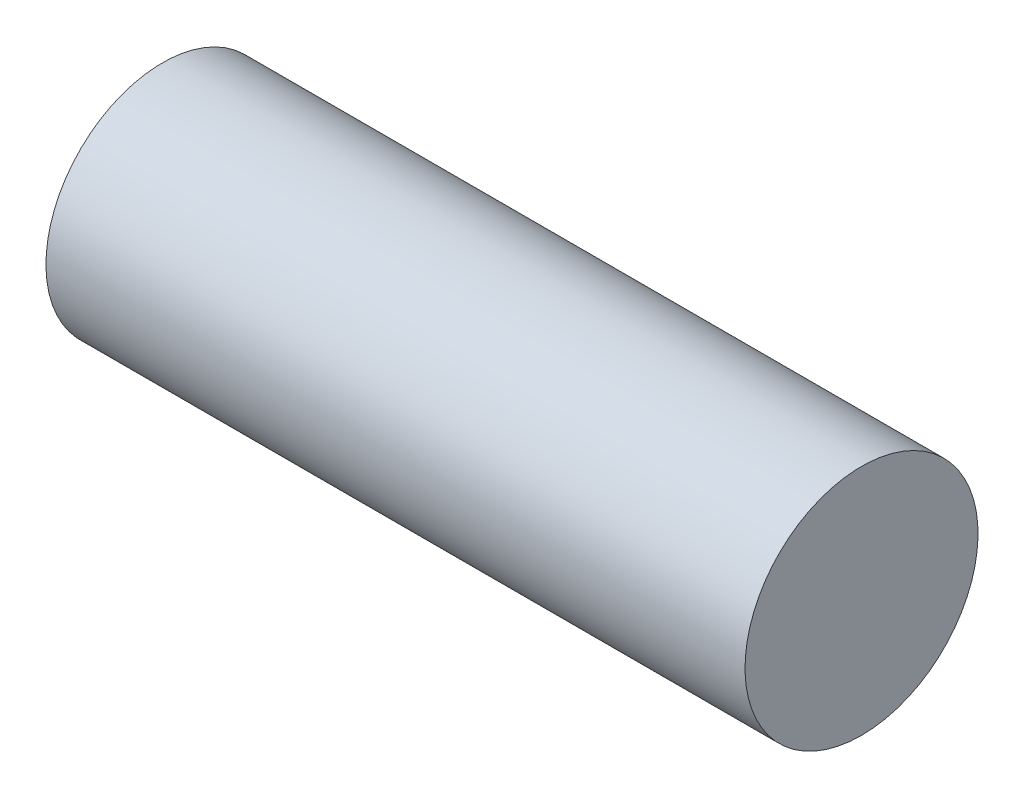
ISO-10303-21;
HEADER;
FILE_DESCRIPTION(('STEP AP214'),'2;1');
FILE_NAME('part.step','',(''),(''),'','','');
FILE_SCHEMA(('AUTOMOTIVE_DESIGN { 1 0 10303 214 1 1 1 1 }'));
ENDSEC;
DATA;
#1=APPLICATION_CONTEXT('core data for automotive mechanical design processes');
#2=APPLICATION_PROTOCOL_DEFINITION('international standard','automotive_design',2000,#1);
#3=PRODUCT_CONTEXT('',#1,'mechanical');
#4=PRODUCT('Part','Part','',(#3));
#5=PRODUCT_RELATED_PRODUCT_CATEGORY('part','',(#4));
#6=PRODUCT_DEFINITION_FORMATION('','',#4);
#7=PRODUCT_DEFINITION_CONTEXT('part definition',#1,'design');
#8=PRODUCT_DEFINITION('design','',#6,#7);
#9=PRODUCT_DEFINITION_SHAPE('','',#8);
#10=(LENGTH_UNIT() NAMED_UNIT(*) SI_UNIT(.MILLI.,.METRE.));
#11=(NAMED_UNIT(*) PLANE_ANGLE_UNIT() SI_UNIT($,.RADIAN.));
#12=(NAMED_UNIT(*) SI_UNIT($,.STERADIAN.) SOLID_ANGLE_UNIT());
#13=UNCERTAINTY_MEASURE_WITH_UNIT(LENGTH_MEASURE(1.E-05),#10,'distance_accuracy_value','');
#14=(GEOMETRIC_REPRESENTATION_CONTEXT(3) GLOBAL_UNCERTAINTY_ASSIGNED_CONTEXT((#13)) GLOBAL_UNIT_ASSIGNED_CONTEXT((#10,
#11,#12)) REPRESENTATION_CONTEXT('',''));
#15=CARTESIAN_POINT('',(0.,0.,0.));
#16=DIRECTION('',(0.,0.,1.));
#17=DIRECTION('',(1.,0.,0.));
#18=AXIS2_PLACEMENT_3D('',#15,#16,#17);
#19=CARTESIAN_POINT('',(0.,5.,0.));
#20=DIRECTION('',(1.,0.,0.));
#21=DIRECTION('',(0.,1.,0.));
#22=AXIS2_PLACEMENT_3D('',#19,#20,#21);
#23=PLANE('',#22);
#24=CARTESIAN_POINT('',(0.,0.,0.));
#25=DIRECTION('',(-1.,0.,0.));
#26=DIRECTION('',(0.,-1.,0.));
#27=AXIS2_PLACEMENT_3D('',#24,#25,#26);
#28=CIRCLE('',#27,5.);
#29=CARTESIAN_POINT('',(0.,-5.,0.));
#30=VERTEX_POINT('',#29);
#31=EDGE_CURVE('E36',#30,#30,#28,.T.);
#32=ORIENTED_EDGE('',*,*,#31,.T.);
#33=EDGE_LOOP('',(#32));
#34=FACE_BOUND('',#33,.T.);
#35=ADVANCED_FACE('F30',(#34),#23,.F.);
#36=CARTESIAN_POINT('',(30.,5.,0.));
#37=DIRECTION('',(-1.,0.,0.));
#38=DIRECTION('',(0.,-1.,0.));
#39=AXIS2_PLACEMENT_3D('',#36,#37,#38);
#40=PLANE('',#39);
#41=CARTESIAN_POINT('',(30.,0.,0.));
#42=DIRECTION('',(-1.,0.,0.));
#43=DIRECTION('',(0.,-1.,0.));
#44=AXIS2_PLACEMENT_3D('',#41,#42,#43);
#45=CIRCLE('',#44,5.);
#46=CARTESIAN_POINT('',(30.,-5.,0.));
#47=VERTEX_POINT('',#46);
#48=EDGE_CURVE('E10',#47,#47,#45,.T.);
#49=ORIENTED_EDGE('',*,*,#48,.F.);
#50=EDGE_LOOP('',(#49));
#51=FACE_BOUND('',#50,.T.);
#52=ADVANCED_FACE('F45',(#51),#40,.F.);
#53=CARTESIAN_POINT('',(0.,0.,0.));
#54=DIRECTION('',(-1.,0.,0.));
#55=DIRECTION('',(0.,-1.,0.));
#56=AXIS2_PLACEMENT_3D('',#53,#54,#55);
#57=CYLINDRICAL_SURFACE('',#56,5.);
#58=ORIENTED_EDGE('',*,*,#31,.F.);
#59=EDGE_LOOP('',(#58));
#60=FACE_BOUND('',#59,.T.);
#61=ORIENTED_EDGE('',*,*,#48,.T.);
#62=EDGE_LOOP('',(#61));
#63=FACE_BOUND('',#62,.T.);
#64=ADVANCED_FACE('F43',(#60,#63),#57,.T.);
#65=CLOSED_SHELL('',(#35,#52,#64));
#66=MANIFOLD_SOLID_BREP('B2',#65);
#67=ADVANCED_BREP_SHAPE_REPRESENTATION('',(#18,#66),#14);
#68=SHAPE_DEFINITION_REPRESENTATION(#9,#67);
ENDSEC;
END-ISO-10303-21;
